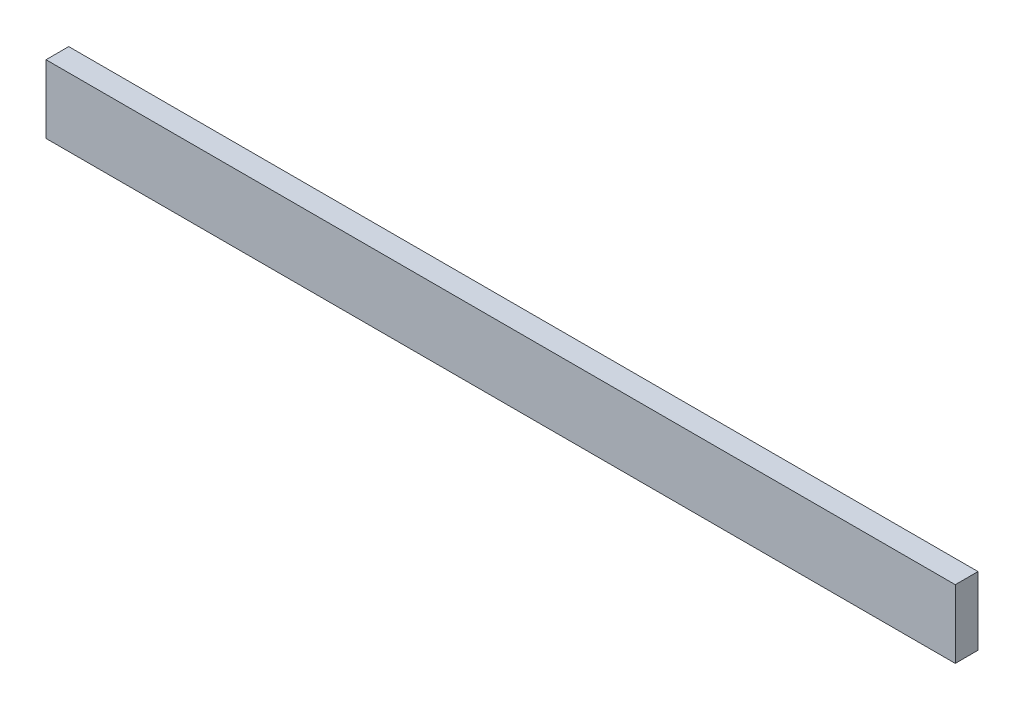
ISO-10303-21;
HEADER;
FILE_DESCRIPTION(('STEP AP214'),'2;1');
FILE_NAME('part.step','',(''),(''),'','','');
FILE_SCHEMA(('AUTOMOTIVE_DESIGN { 1 0 10303 214 1 1 1 1 }'));
ENDSEC;
DATA;
#1=APPLICATION_CONTEXT('core data for automotive mechanical design processes');
#2=APPLICATION_PROTOCOL_DEFINITION('international standard','automotive_design',2000,#1);
#3=PRODUCT_CONTEXT('',#1,'mechanical');
#4=PRODUCT('Part','Part','',(#3));
#5=PRODUCT_RELATED_PRODUCT_CATEGORY('part','',(#4));
#6=PRODUCT_DEFINITION_FORMATION('','',#4);
#7=PRODUCT_DEFINITION_CONTEXT('part definition',#1,'design');
#8=PRODUCT_DEFINITION('design','',#6,#7);
#9=PRODUCT_DEFINITION_SHAPE('','',#8);
#10=(LENGTH_UNIT() NAMED_UNIT(*) SI_UNIT(.MILLI.,.METRE.));
#11=(NAMED_UNIT(*) PLANE_ANGLE_UNIT() SI_UNIT($,.RADIAN.));
#12=(NAMED_UNIT(*) SI_UNIT($,.STERADIAN.) SOLID_ANGLE_UNIT());
#13=UNCERTAINTY_MEASURE_WITH_UNIT(LENGTH_MEASURE(1.E-05),#10,'distance_accuracy_value','');
#14=(GEOMETRIC_REPRESENTATION_CONTEXT(3) GLOBAL_UNCERTAINTY_ASSIGNED_CONTEXT((#13)) GLOBAL_UNIT_ASSIGNED_CONTEXT((#10,
#11,#12)) REPRESENTATION_CONTEXT('',''));
#15=CARTESIAN_POINT('',(0.,0.,0.));
#16=DIRECTION('',(0.,0.,1.));
#17=DIRECTION('',(1.,0.,0.));
#18=AXIS2_PLACEMENT_3D('',#15,#16,#17);
#19=CARTESIAN_POINT('',(508.,-38.1,-12.7));
#20=DIRECTION('',(0.,0.,1.));
#21=DIRECTION('',(1.,0.,0.));
#22=AXIS2_PLACEMENT_3D('',#19,#20,#21);
#23=PLANE('',#22);
#24=DIRECTION('',(0.,1.,0.));
#25=VECTOR('',#24,1.);
#26=CARTESIAN_POINT('',(-508.,-38.1,-12.7));
#27=LINE('',#26,#25);
#28=CARTESIAN_POINT('',(-508.,-38.1,-12.7));
#29=VERTEX_POINT('',#28);
#30=CARTESIAN_POINT('',(-508.,38.1,-12.7));
#31=VERTEX_POINT('',#30);
#32=EDGE_CURVE('E98',#29,#31,#27,.T.);
#33=ORIENTED_EDGE('',*,*,#32,.T.);
#34=DIRECTION('',(-1.,0.,0.));
#35=VECTOR('',#34,1.);
#36=CARTESIAN_POINT('',(508.,38.1,-12.7));
#37=LINE('',#36,#35);
#38=CARTESIAN_POINT('',(508.,38.1,-12.7));
#39=VERTEX_POINT('',#38);
#40=EDGE_CURVE('E11',#39,#31,#37,.T.);
#41=ORIENTED_EDGE('',*,*,#40,.F.);
#42=DIRECTION('',(0.,1.,0.));
#43=VECTOR('',#42,1.);
#44=CARTESIAN_POINT('',(508.,-38.1,-12.7));
#45=LINE('',#44,#43);
#46=CARTESIAN_POINT('',(508.,-38.1,-12.7));
#47=VERTEX_POINT('',#46);
#48=EDGE_CURVE('E86',#47,#39,#45,.T.);
#49=ORIENTED_EDGE('',*,*,#48,.F.);
#50=DIRECTION('',(-1.,0.,0.));
#51=VECTOR('',#50,1.);
#52=CARTESIAN_POINT('',(508.,-38.1,-12.7));
#53=LINE('',#52,#51);
#54=EDGE_CURVE('E94',#47,#29,#53,.T.);
#55=ORIENTED_EDGE('',*,*,#54,.T.);
#56=EDGE_LOOP('',(#33,#41,#49,#55));
#57=FACE_BOUND('',#56,.T.);
#58=ADVANCED_FACE('F35',(#57),#23,.F.);
#59=CARTESIAN_POINT('',(508.,38.1,12.7));
#60=DIRECTION('',(0.,-1.,0.));
#61=DIRECTION('',(0.,0.,-1.));
#62=AXIS2_PLACEMENT_3D('',#59,#60,#61);
#63=PLANE('',#62);
#64=DIRECTION('',(0.,0.,1.));
#65=VECTOR('',#64,1.);
#66=CARTESIAN_POINT('',(-508.,38.1,12.7));
#67=LINE('',#66,#65);
#68=CARTESIAN_POINT('',(-508.,38.1,12.7));
#69=VERTEX_POINT('',#68);
#70=EDGE_CURVE('E90',#31,#69,#67,.T.);
#71=ORIENTED_EDGE('',*,*,#70,.T.);
#72=DIRECTION('',(-1.,0.,0.));
#73=VECTOR('',#72,1.);
#74=CARTESIAN_POINT('',(508.,38.1,12.7));
#75=LINE('',#74,#73);
#76=CARTESIAN_POINT('',(508.,38.1,12.7));
#77=VERTEX_POINT('',#76);
#78=EDGE_CURVE('E43',#77,#69,#75,.T.);
#79=ORIENTED_EDGE('',*,*,#78,.F.);
#80=DIRECTION('',(0.,0.,1.));
#81=VECTOR('',#80,1.);
#82=CARTESIAN_POINT('',(508.,38.1,12.7));
#83=LINE('',#82,#81);
#84=EDGE_CURVE('E81',#39,#77,#83,.T.);
#85=ORIENTED_EDGE('',*,*,#84,.F.);
#86=ORIENTED_EDGE('',*,*,#40,.T.);
#87=EDGE_LOOP('',(#71,#79,#85,#86));
#88=FACE_BOUND('',#87,.T.);
#89=ADVANCED_FACE('F89',(#88),#63,.F.);
#90=CARTESIAN_POINT('',(508.,-38.1,12.7));
#91=DIRECTION('',(0.,0.,-1.));
#92=DIRECTION('',(-1.,0.,0.));
#93=AXIS2_PLACEMENT_3D('',#90,#91,#92);
#94=PLANE('',#93);
#95=DIRECTION('',(0.,-1.,0.));
#96=VECTOR('',#95,1.);
#97=CARTESIAN_POINT('',(-508.,-38.1,12.7));
#98=LINE('',#97,#96);
#99=CARTESIAN_POINT('',(-508.,-38.1,12.7));
#100=VERTEX_POINT('',#99);
#101=EDGE_CURVE('E68',#69,#100,#98,.T.);
#102=ORIENTED_EDGE('',*,*,#101,.T.);
#103=DIRECTION('',(-1.,0.,0.));
#104=VECTOR('',#103,1.);
#105=CARTESIAN_POINT('',(508.,-38.1,12.7));
#106=LINE('',#105,#104);
#107=CARTESIAN_POINT('',(508.,-38.1,12.7));
#108=VERTEX_POINT('',#107);
#109=EDGE_CURVE('E91',#108,#100,#106,.T.);
#110=ORIENTED_EDGE('',*,*,#109,.F.);
#111=DIRECTION('',(0.,-1.,0.));
#112=VECTOR('',#111,1.);
#113=CARTESIAN_POINT('',(508.,-38.1,12.7));
#114=LINE('',#113,#112);
#115=EDGE_CURVE('E84',#77,#108,#114,.T.);
#116=ORIENTED_EDGE('',*,*,#115,.F.);
#117=ORIENTED_EDGE('',*,*,#78,.T.);
#118=EDGE_LOOP('',(#102,#110,#116,#117));
#119=FACE_BOUND('',#118,.T.);
#120=ADVANCED_FACE('F92',(#119),#94,.F.);
#121=CARTESIAN_POINT('',(508.,-38.1,12.7));
#122=DIRECTION('',(0.,1.,0.));
#123=DIRECTION('',(0.,0.,1.));
#124=AXIS2_PLACEMENT_3D('',#121,#122,#123);
#125=PLANE('',#124);
#126=DIRECTION('',(0.,0.,-1.));
#127=VECTOR('',#126,1.);
#128=CARTESIAN_POINT('',(-508.,-38.1,12.7));
#129=LINE('',#128,#127);
#130=EDGE_CURVE('E74',#100,#29,#129,.T.);
#131=ORIENTED_EDGE('',*,*,#130,.T.);
#132=ORIENTED_EDGE('',*,*,#54,.F.);
#133=DIRECTION('',(0.,0.,-1.));
#134=VECTOR('',#133,1.);
#135=CARTESIAN_POINT('',(508.,-38.1,12.7));
#136=LINE('',#135,#134);
#137=EDGE_CURVE('E51',#108,#47,#136,.T.);
#138=ORIENTED_EDGE('',*,*,#137,.F.);
#139=ORIENTED_EDGE('',*,*,#109,.T.);
#140=EDGE_LOOP('',(#131,#132,#138,#139));
#141=FACE_BOUND('',#140,.T.);
#142=ADVANCED_FACE('F105',(#141),#125,.F.);
#143=CARTESIAN_POINT('',(508.,0.,0.));
#144=DIRECTION('',(-1.,0.,0.));
#145=DIRECTION('',(0.,0.,1.));
#146=AXIS2_PLACEMENT_3D('',#143,#144,#145);
#147=PLANE('',#146);
#148=ORIENTED_EDGE('',*,*,#48,.T.);
#149=ORIENTED_EDGE('',*,*,#84,.T.);
#150=ORIENTED_EDGE('',*,*,#115,.T.);
#151=ORIENTED_EDGE('',*,*,#137,.T.);
#152=EDGE_LOOP('',(#148,#149,#150,#151));
#153=FACE_BOUND('',#152,.T.);
#154=ADVANCED_FACE('F82',(#153),#147,.F.);
#155=CARTESIAN_POINT('',(-508.,0.,0.));
#156=DIRECTION('',(-1.,0.,0.));
#157=DIRECTION('',(0.,0.,1.));
#158=AXIS2_PLACEMENT_3D('',#155,#156,#157);
#159=PLANE('',#158);
#160=ORIENTED_EDGE('',*,*,#32,.F.);
#161=ORIENTED_EDGE('',*,*,#130,.F.);
#162=ORIENTED_EDGE('',*,*,#101,.F.);
#163=ORIENTED_EDGE('',*,*,#70,.F.);
#164=EDGE_LOOP('',(#160,#161,#162,#163));
#165=FACE_BOUND('',#164,.T.);
#166=ADVANCED_FACE('F108',(#165),#159,.T.);
#167=CLOSED_SHELL('',(#58,#89,#120,#142,#154,#166));
#168=MANIFOLD_SOLID_BREP('B2',#167);
#169=ADVANCED_BREP_SHAPE_REPRESENTATION('',(#18,#168),#14);
#170=SHAPE_DEFINITION_REPRESENTATION(#9,#169);
ENDSEC;
END-ISO-10303-21;
